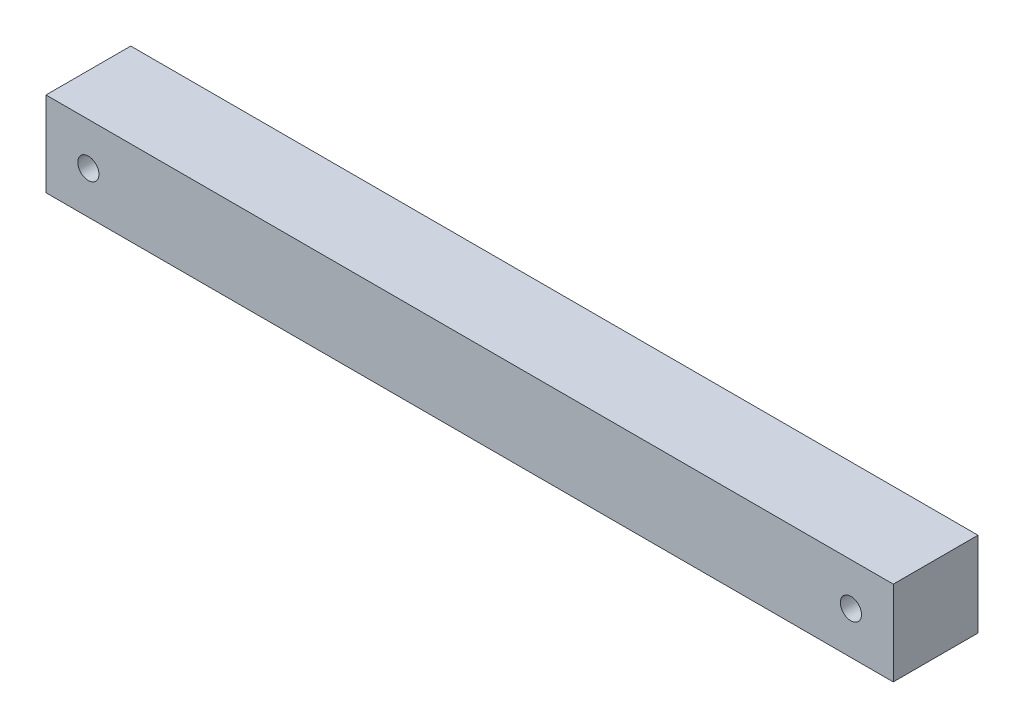
ISO-10303-21;
HEADER;
FILE_DESCRIPTION(('STEP AP214'),'2;1');
FILE_NAME('part.step','',(''),(''),'','','');
FILE_SCHEMA(('AUTOMOTIVE_DESIGN { 1 0 10303 214 1 1 1 1 }'));
ENDSEC;
DATA;
#1=APPLICATION_CONTEXT('core data for automotive mechanical design processes');
#2=APPLICATION_PROTOCOL_DEFINITION('international standard','automotive_design',2000,#1);
#3=PRODUCT_CONTEXT('',#1,'mechanical');
#4=PRODUCT('Part','Part','',(#3));
#5=PRODUCT_RELATED_PRODUCT_CATEGORY('part','',(#4));
#6=PRODUCT_DEFINITION_FORMATION('','',#4);
#7=PRODUCT_DEFINITION_CONTEXT('part definition',#1,'design');
#8=PRODUCT_DEFINITION('design','',#6,#7);
#9=PRODUCT_DEFINITION_SHAPE('','',#8);
#10=(LENGTH_UNIT() NAMED_UNIT(*) SI_UNIT(.MILLI.,.METRE.));
#11=(NAMED_UNIT(*) PLANE_ANGLE_UNIT() SI_UNIT($,.RADIAN.));
#12=(NAMED_UNIT(*) SI_UNIT($,.STERADIAN.) SOLID_ANGLE_UNIT());
#13=UNCERTAINTY_MEASURE_WITH_UNIT(LENGTH_MEASURE(1.E-05),#10,'distance_accuracy_value','');
#14=(GEOMETRIC_REPRESENTATION_CONTEXT(3) GLOBAL_UNCERTAINTY_ASSIGNED_CONTEXT((#13)) GLOBAL_UNIT_ASSIGNED_CONTEXT((#10,
#11,#12)) REPRESENTATION_CONTEXT('',''));
#15=CARTESIAN_POINT('',(0.,0.,0.));
#16=DIRECTION('',(0.,0.,1.));
#17=DIRECTION('',(1.,0.,0.));
#18=AXIS2_PLACEMENT_3D('',#15,#16,#17);
#19=CARTESIAN_POINT('',(3658.01046787743,328.302188153447,12.7));
#20=DIRECTION('',(0.,0.,1.));
#21=DIRECTION('',(1.,0.,0.));
#22=AXIS2_PLACEMENT_3D('',#19,#20,#21);
#23=PLANE('',#22);
#24=CARTESIAN_POINT('',(3670.71046787743,341.002188153447,12.7));
#25=DIRECTION('',(0.,0.,1.));
#26=DIRECTION('',(1.,0.,0.));
#27=AXIS2_PLACEMENT_3D('',#24,#25,#26);
#28=CIRCLE('',#27,3.17500000000009);
#29=CARTESIAN_POINT('',(3673.88546787743,341.002188153447,12.7));
#30=VERTEX_POINT('',#29);
#31=EDGE_CURVE('E85',#30,#30,#28,.T.);
#32=ORIENTED_EDGE('',*,*,#31,.F.);
#33=EDGE_LOOP('',(#32));
#34=FACE_BOUND('',#33,.T.);
#35=DIRECTION('',(0.,-1.,0.));
#36=VECTOR('',#35,1.);
#37=CARTESIAN_POINT('',(3658.01046787743,353.702188153447,12.7));
#38=LINE('',#37,#36);
#39=CARTESIAN_POINT('',(3658.01046787743,353.702188153447,12.7));
#40=VERTEX_POINT('',#39);
#41=CARTESIAN_POINT('',(3658.01046787743,328.302188153447,12.7));
#42=VERTEX_POINT('',#41);
#43=EDGE_CURVE('E95',#40,#42,#38,.T.);
#44=ORIENTED_EDGE('',*,*,#43,.T.);
#45=DIRECTION('',(1.,0.,0.));
#46=VECTOR('',#45,1.);
#47=CARTESIAN_POINT('',(3658.01046787743,328.302188153447,12.7));
#48=LINE('',#47,#46);
#49=CARTESIAN_POINT('',(3912.01046787743,328.302188153447,12.7));
#50=VERTEX_POINT('',#49);
#51=EDGE_CURVE('E80',#42,#50,#48,.T.);
#52=ORIENTED_EDGE('',*,*,#51,.T.);
#53=DIRECTION('',(0.,1.,0.));
#54=VECTOR('',#53,1.);
#55=CARTESIAN_POINT('',(3912.01046787743,353.702188153447,12.7));
#56=LINE('',#55,#54);
#57=CARTESIAN_POINT('',(3912.01046787743,353.702188153447,12.7));
#58=VERTEX_POINT('',#57);
#59=EDGE_CURVE('E46',#50,#58,#56,.T.);
#60=ORIENTED_EDGE('',*,*,#59,.T.);
#61=DIRECTION('',(-1.,0.,0.));
#62=VECTOR('',#61,1.);
#63=CARTESIAN_POINT('',(3658.01046787743,353.702188153447,12.7));
#64=LINE('',#63,#62);
#65=EDGE_CURVE('E41',#58,#40,#64,.T.);
#66=ORIENTED_EDGE('',*,*,#65,.T.);
#67=EDGE_LOOP('',(#44,#52,#60,#66));
#68=FACE_BOUND('',#67,.T.);
#69=CARTESIAN_POINT('',(3899.31046787743,341.002188153447,12.7));
#70=DIRECTION('',(0.,0.,1.));
#71=DIRECTION('',(1.,0.,0.));
#72=AXIS2_PLACEMENT_3D('',#69,#70,#71);
#73=CIRCLE('',#72,3.17500000000009);
#74=CARTESIAN_POINT('',(3902.48546787743,341.002188153447,12.7));
#75=VERTEX_POINT('',#74);
#76=EDGE_CURVE('E113',#75,#75,#73,.T.);
#77=ORIENTED_EDGE('',*,*,#76,.F.);
#78=EDGE_LOOP('',(#77));
#79=FACE_BOUND('',#78,.T.);
#80=ADVANCED_FACE('F26',(#34,#68,#79),#23,.T.);
#81=CARTESIAN_POINT('',(3658.01046787743,328.302188153447,-12.7));
#82=DIRECTION('',(0.,0.,1.));
#83=DIRECTION('',(1.,0.,0.));
#84=AXIS2_PLACEMENT_3D('',#81,#82,#83);
#85=PLANE('',#84);
#86=CARTESIAN_POINT('',(3670.71046787743,341.002188153447,-12.7));
#87=DIRECTION('',(0.,0.,1.));
#88=DIRECTION('',(1.,0.,0.));
#89=AXIS2_PLACEMENT_3D('',#86,#87,#88);
#90=CIRCLE('',#89,3.17500000000009);
#91=CARTESIAN_POINT('',(3673.88546787743,341.002188153447,-12.7));
#92=VERTEX_POINT('',#91);
#93=EDGE_CURVE('E88',#92,#92,#90,.T.);
#94=ORIENTED_EDGE('',*,*,#93,.T.);
#95=EDGE_LOOP('',(#94));
#96=FACE_BOUND('',#95,.T.);
#97=DIRECTION('',(0.,-1.,0.));
#98=VECTOR('',#97,1.);
#99=CARTESIAN_POINT('',(3658.01046787743,353.702188153447,-12.7));
#100=LINE('',#99,#98);
#101=CARTESIAN_POINT('',(3658.01046787743,353.702188153447,-12.7));
#102=VERTEX_POINT('',#101);
#103=CARTESIAN_POINT('',(3658.01046787743,328.302188153447,-12.7));
#104=VERTEX_POINT('',#103);
#105=EDGE_CURVE('E72',#102,#104,#100,.T.);
#106=ORIENTED_EDGE('',*,*,#105,.F.);
#107=DIRECTION('',(-1.,0.,0.));
#108=VECTOR('',#107,1.);
#109=CARTESIAN_POINT('',(3658.01046787743,353.702188153447,-12.7));
#110=LINE('',#109,#108);
#111=CARTESIAN_POINT('',(3912.01046787743,353.702188153447,-12.7));
#112=VERTEX_POINT('',#111);
#113=EDGE_CURVE('E93',#112,#102,#110,.T.);
#114=ORIENTED_EDGE('',*,*,#113,.F.);
#115=DIRECTION('',(0.,1.,0.));
#116=VECTOR('',#115,1.);
#117=CARTESIAN_POINT('',(3912.01046787743,353.702188153447,-12.7));
#118=LINE('',#117,#116);
#119=CARTESIAN_POINT('',(3912.01046787743,328.302188153447,-12.7));
#120=VERTEX_POINT('',#119);
#121=EDGE_CURVE('E73',#120,#112,#118,.T.);
#122=ORIENTED_EDGE('',*,*,#121,.F.);
#123=DIRECTION('',(1.,0.,0.));
#124=VECTOR('',#123,1.);
#125=CARTESIAN_POINT('',(3658.01046787743,328.302188153447,-12.7));
#126=LINE('',#125,#124);
#127=EDGE_CURVE('E67',#104,#120,#126,.T.);
#128=ORIENTED_EDGE('',*,*,#127,.F.);
#129=EDGE_LOOP('',(#106,#114,#122,#128));
#130=FACE_BOUND('',#129,.T.);
#131=CARTESIAN_POINT('',(3899.31046787743,341.002188153447,-12.7));
#132=DIRECTION('',(0.,0.,1.));
#133=DIRECTION('',(1.,0.,0.));
#134=AXIS2_PLACEMENT_3D('',#131,#132,#133);
#135=CIRCLE('',#134,3.17500000000009);
#136=CARTESIAN_POINT('',(3902.48546787743,341.002188153447,-12.7));
#137=VERTEX_POINT('',#136);
#138=EDGE_CURVE('E115',#137,#137,#135,.T.);
#139=ORIENTED_EDGE('',*,*,#138,.T.);
#140=EDGE_LOOP('',(#139));
#141=FACE_BOUND('',#140,.T.);
#142=ADVANCED_FACE('F68',(#96,#130,#141),#85,.F.);
#143=CARTESIAN_POINT('',(3658.01046787743,353.702188153447,12.7));
#144=DIRECTION('',(1.,0.,0.));
#145=DIRECTION('',(0.,0.,-1.));
#146=AXIS2_PLACEMENT_3D('',#143,#144,#145);
#147=PLANE('',#146);
#148=ORIENTED_EDGE('',*,*,#105,.T.);
#149=DIRECTION('',(0.,0.,-1.));
#150=VECTOR('',#149,1.);
#151=CARTESIAN_POINT('',(3658.01046787743,328.302188153447,12.7));
#152=LINE('',#151,#150);
#153=EDGE_CURVE('E11',#42,#104,#152,.T.);
#154=ORIENTED_EDGE('',*,*,#153,.F.);
#155=ORIENTED_EDGE('',*,*,#43,.F.);
#156=DIRECTION('',(0.,0.,-1.));
#157=VECTOR('',#156,1.);
#158=CARTESIAN_POINT('',(3658.01046787743,353.702188153447,12.7));
#159=LINE('',#158,#157);
#160=EDGE_CURVE('E84',#40,#102,#159,.T.);
#161=ORIENTED_EDGE('',*,*,#160,.T.);
#162=EDGE_LOOP('',(#148,#154,#155,#161));
#163=FACE_BOUND('',#162,.T.);
#164=ADVANCED_FACE('F28',(#163),#147,.F.);
#165=CARTESIAN_POINT('',(3658.01046787743,328.302188153447,12.7));
#166=DIRECTION('',(0.,1.,0.));
#167=DIRECTION('',(0.,0.,1.));
#168=AXIS2_PLACEMENT_3D('',#165,#166,#167);
#169=PLANE('',#168);
#170=ORIENTED_EDGE('',*,*,#127,.T.);
#171=DIRECTION('',(0.,0.,-1.));
#172=VECTOR('',#171,1.);
#173=CARTESIAN_POINT('',(3912.01046787743,328.302188153447,12.7));
#174=LINE('',#173,#172);
#175=EDGE_CURVE('E34',#50,#120,#174,.T.);
#176=ORIENTED_EDGE('',*,*,#175,.F.);
#177=ORIENTED_EDGE('',*,*,#51,.F.);
#178=ORIENTED_EDGE('',*,*,#153,.T.);
#179=EDGE_LOOP('',(#170,#176,#177,#178));
#180=FACE_BOUND('',#179,.T.);
#181=ADVANCED_FACE('F79',(#180),#169,.F.);
#182=CARTESIAN_POINT('',(3912.01046787743,353.702188153447,12.7));
#183=DIRECTION('',(-1.,0.,0.));
#184=DIRECTION('',(0.,0.,1.));
#185=AXIS2_PLACEMENT_3D('',#182,#183,#184);
#186=PLANE('',#185);
#187=ORIENTED_EDGE('',*,*,#121,.T.);
#188=DIRECTION('',(0.,0.,-1.));
#189=VECTOR('',#188,1.);
#190=CARTESIAN_POINT('',(3912.01046787743,353.702188153447,12.7));
#191=LINE('',#190,#189);
#192=EDGE_CURVE('E101',#58,#112,#191,.T.);
#193=ORIENTED_EDGE('',*,*,#192,.F.);
#194=ORIENTED_EDGE('',*,*,#59,.F.);
#195=ORIENTED_EDGE('',*,*,#175,.T.);
#196=EDGE_LOOP('',(#187,#193,#194,#195));
#197=FACE_BOUND('',#196,.T.);
#198=ADVANCED_FACE('F104',(#197),#186,.F.);
#199=CARTESIAN_POINT('',(3658.01046787743,353.702188153447,12.7));
#200=DIRECTION('',(0.,-1.,0.));
#201=DIRECTION('',(0.,0.,-1.));
#202=AXIS2_PLACEMENT_3D('',#199,#200,#201);
#203=PLANE('',#202);
#204=ORIENTED_EDGE('',*,*,#113,.T.);
#205=ORIENTED_EDGE('',*,*,#160,.F.);
#206=ORIENTED_EDGE('',*,*,#65,.F.);
#207=ORIENTED_EDGE('',*,*,#192,.T.);
#208=EDGE_LOOP('',(#204,#205,#206,#207));
#209=FACE_BOUND('',#208,.T.);
#210=ADVANCED_FACE('F106',(#209),#203,.F.);
#211=CARTESIAN_POINT('',(3670.71046787743,341.002188153447,12.7));
#212=DIRECTION('',(0.,0.,-1.));
#213=DIRECTION('',(-1.,0.,0.));
#214=AXIS2_PLACEMENT_3D('',#211,#212,#213);
#215=CYLINDRICAL_SURFACE('',#214,3.17500000000009);
#216=ORIENTED_EDGE('',*,*,#31,.T.);
#217=EDGE_LOOP('',(#216));
#218=FACE_BOUND('',#217,.T.);
#219=ORIENTED_EDGE('',*,*,#93,.F.);
#220=EDGE_LOOP('',(#219));
#221=FACE_BOUND('',#220,.T.);
#222=ADVANCED_FACE('F124',(#218,#221),#215,.F.);
#223=CARTESIAN_POINT('',(3899.31046787743,341.002188153447,12.7));
#224=DIRECTION('',(0.,0.,-1.));
#225=DIRECTION('',(-1.,0.,0.));
#226=AXIS2_PLACEMENT_3D('',#223,#224,#225);
#227=CYLINDRICAL_SURFACE('',#226,3.17500000000009);
#228=ORIENTED_EDGE('',*,*,#76,.T.);
#229=EDGE_LOOP('',(#228));
#230=FACE_BOUND('',#229,.T.);
#231=ORIENTED_EDGE('',*,*,#138,.F.);
#232=EDGE_LOOP('',(#231));
#233=FACE_BOUND('',#232,.T.);
#234=ADVANCED_FACE('F122',(#230,#233),#227,.F.);
#235=CLOSED_SHELL('',(#80,#142,#164,#181,#198,#210,#222,#234));
#236=MANIFOLD_SOLID_BREP('B2',#235);
#237=ADVANCED_BREP_SHAPE_REPRESENTATION('',(#18,#236),#14);
#238=SHAPE_DEFINITION_REPRESENTATION(#9,#237);
ENDSEC;
END-ISO-10303-21;
